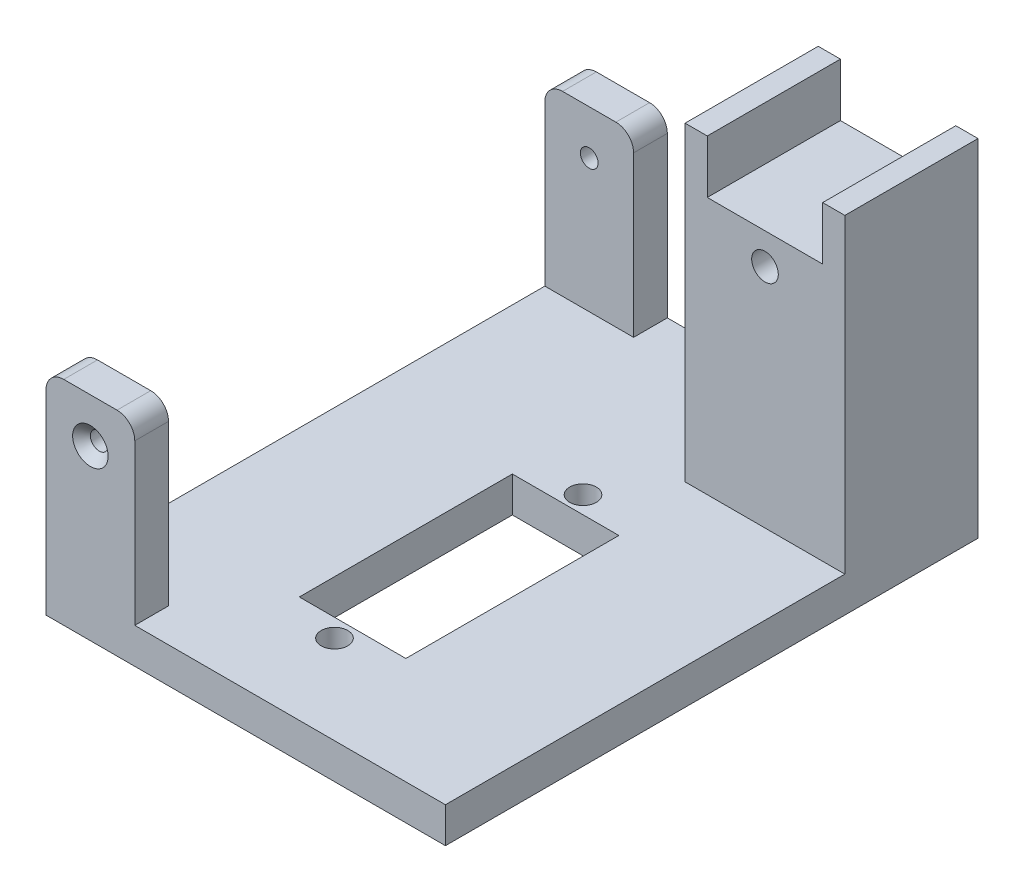
ISO-10303-21;
HEADER;
FILE_DESCRIPTION(('STEP AP214'),'2;1');
FILE_NAME('part.step','',(''),(''),'','','');
FILE_SCHEMA(('AUTOMOTIVE_DESIGN { 1 0 10303 214 1 1 1 1 }'));
ENDSEC;
DATA;
#1=APPLICATION_CONTEXT('core data for automotive mechanical design processes');
#2=APPLICATION_PROTOCOL_DEFINITION('international standard','automotive_design',2000,#1);
#3=PRODUCT_CONTEXT('',#1,'mechanical');
#4=PRODUCT('Part','Part','',(#3));
#5=PRODUCT_RELATED_PRODUCT_CATEGORY('part','',(#4));
#6=PRODUCT_DEFINITION_FORMATION('','',#4);
#7=PRODUCT_DEFINITION_CONTEXT('part definition',#1,'design');
#8=PRODUCT_DEFINITION('design','',#6,#7);
#9=PRODUCT_DEFINITION_SHAPE('','',#8);
#10=(LENGTH_UNIT() NAMED_UNIT(*) SI_UNIT(.MILLI.,.METRE.));
#11=(NAMED_UNIT(*) PLANE_ANGLE_UNIT() SI_UNIT($,.RADIAN.));
#12=(NAMED_UNIT(*) SI_UNIT($,.STERADIAN.) SOLID_ANGLE_UNIT());
#13=UNCERTAINTY_MEASURE_WITH_UNIT(LENGTH_MEASURE(1.E-05),#10,'distance_accuracy_value','');
#14=(GEOMETRIC_REPRESENTATION_CONTEXT(3) GLOBAL_UNCERTAINTY_ASSIGNED_CONTEXT((#13)) GLOBAL_UNIT_ASSIGNED_CONTEXT((#10,
#11,#12)) REPRESENTATION_CONTEXT('',''));
#15=CARTESIAN_POINT('',(0.,0.,0.));
#16=DIRECTION('',(0.,0.,1.));
#17=DIRECTION('',(1.,0.,0.));
#18=AXIS2_PLACEMENT_3D('',#15,#16,#17);
#19=CARTESIAN_POINT('',(0.,4.,0.));
#20=DIRECTION('',(0.,1.,0.));
#21=DIRECTION('',(0.,0.,1.));
#22=AXIS2_PLACEMENT_3D('',#19,#20,#21);
#23=PLANE('',#22);
#24=CARTESIAN_POINT('',(0.,4.,-8.));
#25=DIRECTION('',(0.,1.,0.));
#26=DIRECTION('',(0.,0.,1.));
#27=AXIS2_PLACEMENT_3D('',#24,#25,#26);
#28=CIRCLE('',#27,1.5);
#29=CARTESIAN_POINT('',(0.,4.,-6.5));
#30=VERTEX_POINT('',#29);
#31=EDGE_CURVE('E822',#30,#30,#28,.F.);
#32=ORIENTED_EDGE('',*,*,#31,.T.);
#33=EDGE_LOOP('',(#32));
#34=FACE_BOUND('',#33,.T.);
#35=CARTESIAN_POINT('',(0.,4.,20.));
#36=DIRECTION('',(0.,1.,0.));
#37=DIRECTION('',(0.,0.,1.));
#38=AXIS2_PLACEMENT_3D('',#35,#36,#37);
#39=CIRCLE('',#38,1.5);
#40=CARTESIAN_POINT('',(0.,4.,21.5));
#41=VERTEX_POINT('',#40);
#42=EDGE_CURVE('E826',#41,#41,#39,.F.);
#43=ORIENTED_EDGE('',*,*,#42,.T.);
#44=EDGE_LOOP('',(#43));
#45=FACE_BOUND('',#44,.T.);
#46=DIRECTION('',(1.,0.,0.));
#47=VECTOR('',#46,1.);
#48=CARTESIAN_POINT('',(4.50000000000001,4.,-15.));
#49=LINE('',#48,#47);
#50=CARTESIAN_POINT('',(4.50000000000001,4.,-15.));
#51=VERTEX_POINT('',#50);
#52=CARTESIAN_POINT('',(22.5,4.,-15.));
#53=VERTEX_POINT('',#52);
#54=EDGE_CURVE('E278',#51,#53,#49,.T.);
#55=ORIENTED_EDGE('',*,*,#54,.F.);
#56=DIRECTION('',(0.,0.,1.));
#57=VECTOR('',#56,1.);
#58=CARTESIAN_POINT('',(4.5,4.,-30.));
#59=LINE('',#58,#57);
#60=CARTESIAN_POINT('',(4.5,4.,-30.));
#61=VERTEX_POINT('',#60);
#62=EDGE_CURVE('E273',#61,#51,#59,.T.);
#63=ORIENTED_EDGE('',*,*,#62,.F.);
#64=DIRECTION('',(-1.,0.,0.));
#65=VECTOR('',#64,1.);
#66=CARTESIAN_POINT('',(-22.5,4.,-30.));
#67=LINE('',#66,#65);
#68=CARTESIAN_POINT('',(-12.5,4.,-30.));
#69=VERTEX_POINT('',#68);
#70=EDGE_CURVE('E344',#61,#69,#67,.T.);
#71=ORIENTED_EDGE('',*,*,#70,.T.);
#72=DIRECTION('',(0.,0.,-1.));
#73=VECTOR('',#72,1.);
#74=CARTESIAN_POINT('',(-12.5,4.,-30.));
#75=LINE('',#74,#73);
#76=CARTESIAN_POINT('',(-12.5,4.,-26.2));
#77=VERTEX_POINT('',#76);
#78=EDGE_CURVE('E313',#77,#69,#75,.T.);
#79=ORIENTED_EDGE('',*,*,#78,.F.);
#80=DIRECTION('',(1.,0.,0.));
#81=VECTOR('',#80,1.);
#82=CARTESIAN_POINT('',(-22.5,4.,-26.2));
#83=LINE('',#82,#81);
#84=CARTESIAN_POINT('',(-22.5,4.,-26.2));
#85=VERTEX_POINT('',#84);
#86=EDGE_CURVE('E309',#85,#77,#83,.T.);
#87=ORIENTED_EDGE('',*,*,#86,.F.);
#88=DIRECTION('',(0.,0.,1.));
#89=VECTOR('',#88,1.);
#90=CARTESIAN_POINT('',(-22.5,4.,-30.));
#91=LINE('',#90,#89);
#92=CARTESIAN_POINT('',(-22.5,4.,26.2));
#93=VERTEX_POINT('',#92);
#94=EDGE_CURVE('E348',#85,#93,#91,.T.);
#95=ORIENTED_EDGE('',*,*,#94,.T.);
#96=DIRECTION('',(-1.,0.,0.));
#97=VECTOR('',#96,1.);
#98=CARTESIAN_POINT('',(-22.5,4.,26.2));
#99=LINE('',#98,#97);
#100=CARTESIAN_POINT('',(-12.5,4.,26.2));
#101=VERTEX_POINT('',#100);
#102=EDGE_CURVE('E331',#101,#93,#99,.T.);
#103=ORIENTED_EDGE('',*,*,#102,.F.);
#104=DIRECTION('',(0.,0.,-1.));
#105=VECTOR('',#104,1.);
#106=CARTESIAN_POINT('',(-12.5,4.,26.2));
#107=LINE('',#106,#105);
#108=CARTESIAN_POINT('',(-12.5,4.,30.));
#109=VERTEX_POINT('',#108);
#110=EDGE_CURVE('E316',#109,#101,#107,.T.);
#111=ORIENTED_EDGE('',*,*,#110,.F.);
#112=DIRECTION('',(1.,0.,0.));
#113=VECTOR('',#112,1.);
#114=CARTESIAN_POINT('',(-22.5,4.,30.));
#115=LINE('',#114,#113);
#116=CARTESIAN_POINT('',(22.5,4.,30.));
#117=VERTEX_POINT('',#116);
#118=EDGE_CURVE('E351',#109,#117,#115,.T.);
#119=ORIENTED_EDGE('',*,*,#118,.T.);
#120=DIRECTION('',(0.,0.,-1.));
#121=VECTOR('',#120,1.);
#122=CARTESIAN_POINT('',(22.5,4.,-30.));
#123=LINE('',#122,#121);
#124=EDGE_CURVE('E341',#117,#53,#123,.T.);
#125=ORIENTED_EDGE('',*,*,#124,.T.);
#126=EDGE_LOOP('',(#55,#63,#71,#79,#87,#95,#103,#111,#119,#125));
#127=FACE_BOUND('',#126,.T.);
#128=DIRECTION('',(0.,0.,-1.));
#129=VECTOR('',#128,1.);
#130=CARTESIAN_POINT('',(6.,4.,17.9601856714293));
#131=LINE('',#130,#129);
#132=CARTESIAN_POINT('',(6.,4.,17.9601856714293));
#133=VERTEX_POINT('',#132);
#134=CARTESIAN_POINT('',(6.,4.,-6.03981432857072));
#135=VERTEX_POINT('',#134);
#136=EDGE_CURVE('E241',#133,#135,#131,.T.);
#137=ORIENTED_EDGE('',*,*,#136,.F.);
#138=DIRECTION('',(1.,0.,0.));
#139=VECTOR('',#138,1.);
#140=CARTESIAN_POINT('',(-6.,4.,17.9601856714293));
#141=LINE('',#140,#139);
#142=CARTESIAN_POINT('',(-6.,4.,17.9601856714293));
#143=VERTEX_POINT('',#142);
#144=EDGE_CURVE('E239',#143,#133,#141,.T.);
#145=ORIENTED_EDGE('',*,*,#144,.F.);
#146=DIRECTION('',(0.,0.,-1.));
#147=VECTOR('',#146,1.);
#148=CARTESIAN_POINT('',(-6.,4.,17.9601856714293));
#149=LINE('',#148,#147);
#150=CARTESIAN_POINT('',(-6.,4.,-6.03981432857072));
#151=VERTEX_POINT('',#150);
#152=EDGE_CURVE('E833',#143,#151,#149,.T.);
#153=ORIENTED_EDGE('',*,*,#152,.T.);
#154=DIRECTION('',(1.,0.,0.));
#155=VECTOR('',#154,1.);
#156=CARTESIAN_POINT('',(-6.,4.,-6.03981432857072));
#157=LINE('',#156,#155);
#158=EDGE_CURVE('E221',#151,#135,#157,.T.);
#159=ORIENTED_EDGE('',*,*,#158,.T.);
#160=EDGE_LOOP('',(#137,#145,#153,#159));
#161=FACE_BOUND('',#160,.T.);
#162=ADVANCED_FACE('F47',(#34,#45,#127,#161),#23,.T.);
#163=CARTESIAN_POINT('',(0.,0.,0.));
#164=DIRECTION('',(0.,1.,0.));
#165=DIRECTION('',(0.,0.,1.));
#166=AXIS2_PLACEMENT_3D('',#163,#164,#165);
#167=PLANE('',#166);
#168=CARTESIAN_POINT('',(0.,0.,-8.));
#169=DIRECTION('',(0.,-1.,0.));
#170=DIRECTION('',(0.,0.,-1.));
#171=AXIS2_PLACEMENT_3D('',#168,#169,#170);
#172=CIRCLE('',#171,1.5);
#173=CARTESIAN_POINT('',(0.,0.,-9.5));
#174=VERTEX_POINT('',#173);
#175=EDGE_CURVE('E249',#174,#174,#172,.T.);
#176=ORIENTED_EDGE('',*,*,#175,.F.);
#177=EDGE_LOOP('',(#176));
#178=FACE_BOUND('',#177,.T.);
#179=CARTESIAN_POINT('',(0.,0.,20.));
#180=DIRECTION('',(0.,-1.,0.));
#181=DIRECTION('',(0.,0.,-1.));
#182=AXIS2_PLACEMENT_3D('',#179,#180,#181);
#183=CIRCLE('',#182,1.5);
#184=CARTESIAN_POINT('',(0.,0.,18.5));
#185=VERTEX_POINT('',#184);
#186=EDGE_CURVE('E244',#185,#185,#183,.T.);
#187=ORIENTED_EDGE('',*,*,#186,.F.);
#188=EDGE_LOOP('',(#187));
#189=FACE_BOUND('',#188,.T.);
#190=DIRECTION('',(0.,0.,-1.));
#191=VECTOR('',#190,1.);
#192=CARTESIAN_POINT('',(22.5,0.,-30.));
#193=LINE('',#192,#191);
#194=CARTESIAN_POINT('',(22.5,0.,30.));
#195=VERTEX_POINT('',#194);
#196=CARTESIAN_POINT('',(22.5,0.,-30.));
#197=VERTEX_POINT('',#196);
#198=EDGE_CURVE('E324',#195,#197,#193,.T.);
#199=ORIENTED_EDGE('',*,*,#198,.F.);
#200=DIRECTION('',(1.,0.,0.));
#201=VECTOR('',#200,1.);
#202=CARTESIAN_POINT('',(-22.5,0.,30.));
#203=LINE('',#202,#201);
#204=CARTESIAN_POINT('',(-22.5,0.,30.));
#205=VERTEX_POINT('',#204);
#206=EDGE_CURVE('E345',#205,#195,#203,.T.);
#207=ORIENTED_EDGE('',*,*,#206,.F.);
#208=DIRECTION('',(0.,0.,1.));
#209=VECTOR('',#208,1.);
#210=CARTESIAN_POINT('',(-22.5,0.,-30.));
#211=LINE('',#210,#209);
#212=CARTESIAN_POINT('',(-22.5,0.,-30.));
#213=VERTEX_POINT('',#212);
#214=EDGE_CURVE('E359',#213,#205,#211,.T.);
#215=ORIENTED_EDGE('',*,*,#214,.F.);
#216=DIRECTION('',(-1.,0.,0.));
#217=VECTOR('',#216,1.);
#218=CARTESIAN_POINT('',(-22.5,0.,-30.));
#219=LINE('',#218,#217);
#220=EDGE_CURVE('E356',#197,#213,#219,.T.);
#221=ORIENTED_EDGE('',*,*,#220,.F.);
#222=EDGE_LOOP('',(#199,#207,#215,#221));
#223=FACE_BOUND('',#222,.T.);
#224=DIRECTION('',(1.,0.,0.));
#225=VECTOR('',#224,1.);
#226=CARTESIAN_POINT('',(-6.,0.,17.9601856714293));
#227=LINE('',#226,#225);
#228=CARTESIAN_POINT('',(-6.,0.,17.9601856714293));
#229=VERTEX_POINT('',#228);
#230=CARTESIAN_POINT('',(6.,0.,17.9601856714293));
#231=VERTEX_POINT('',#230);
#232=EDGE_CURVE('E71',#229,#231,#227,.T.);
#233=ORIENTED_EDGE('',*,*,#232,.T.);
#234=DIRECTION('',(0.,0.,-1.));
#235=VECTOR('',#234,1.);
#236=CARTESIAN_POINT('',(6.,0.,17.9601856714293));
#237=LINE('',#236,#235);
#238=CARTESIAN_POINT('',(6.,0.,-6.03981432857072));
#239=VERTEX_POINT('',#238);
#240=EDGE_CURVE('E233',#231,#239,#237,.T.);
#241=ORIENTED_EDGE('',*,*,#240,.T.);
#242=DIRECTION('',(1.,0.,0.));
#243=VECTOR('',#242,1.);
#244=CARTESIAN_POINT('',(-6.,0.,-6.03981432857072));
#245=LINE('',#244,#243);
#246=CARTESIAN_POINT('',(-6.,0.,-6.03981432857072));
#247=VERTEX_POINT('',#246);
#248=EDGE_CURVE('E218',#247,#239,#245,.T.);
#249=ORIENTED_EDGE('',*,*,#248,.F.);
#250=DIRECTION('',(0.,0.,-1.));
#251=VECTOR('',#250,1.);
#252=CARTESIAN_POINT('',(-6.,0.,17.9601856714293));
#253=LINE('',#252,#251);
#254=EDGE_CURVE('E227',#229,#247,#253,.T.);
#255=ORIENTED_EDGE('',*,*,#254,.F.);
#256=EDGE_LOOP('',(#233,#241,#249,#255));
#257=FACE_BOUND('',#256,.T.);
#258=ADVANCED_FACE('F231',(#178,#189,#223,#257),#167,.F.);
#259=CARTESIAN_POINT('',(0.,39.,0.));
#260=DIRECTION('',(0.,1.,0.));
#261=DIRECTION('',(0.,0.,1.));
#262=AXIS2_PLACEMENT_3D('',#259,#260,#261);
#263=PLANE('',#262);
#264=DIRECTION('',(0.,0.,-1.));
#265=VECTOR('',#264,1.);
#266=CARTESIAN_POINT('',(20.,39.,0.));
#267=LINE('',#266,#265);
#268=CARTESIAN_POINT('',(20.,39.,-15.));
#269=VERTEX_POINT('',#268);
#270=CARTESIAN_POINT('',(20.,39.,-30.));
#271=VERTEX_POINT('',#270);
#272=EDGE_CURVE('E372',#269,#271,#267,.T.);
#273=ORIENTED_EDGE('',*,*,#272,.F.);
#274=DIRECTION('',(1.,0.,0.));
#275=VECTOR('',#274,1.);
#276=CARTESIAN_POINT('',(4.50000000000001,39.,-15.));
#277=LINE('',#276,#275);
#278=CARTESIAN_POINT('',(22.5,39.,-15.));
#279=VERTEX_POINT('',#278);
#280=EDGE_CURVE('E284',#269,#279,#277,.T.);
#281=ORIENTED_EDGE('',*,*,#280,.T.);
#282=DIRECTION('',(0.,0.,-1.));
#283=VECTOR('',#282,1.);
#284=CARTESIAN_POINT('',(22.5,39.,-30.));
#285=LINE('',#284,#283);
#286=CARTESIAN_POINT('',(22.5,39.,-30.));
#287=VERTEX_POINT('',#286);
#288=EDGE_CURVE('E274',#279,#287,#285,.T.);
#289=ORIENTED_EDGE('',*,*,#288,.T.);
#290=DIRECTION('',(-1.,0.,0.));
#291=VECTOR('',#290,1.);
#292=CARTESIAN_POINT('',(4.5,39.,-30.));
#293=LINE('',#292,#291);
#294=EDGE_CURVE('E279',#287,#271,#293,.T.);
#295=ORIENTED_EDGE('',*,*,#294,.T.);
#296=EDGE_LOOP('',(#273,#281,#289,#295));
#297=FACE_BOUND('',#296,.T.);
#298=ADVANCED_FACE('F443',(#297),#263,.T.);
#299=CARTESIAN_POINT('',(22.5,4.,-30.));
#300=DIRECTION('',(-1.,0.,0.));
#301=DIRECTION('',(0.,0.,1.));
#302=AXIS2_PLACEMENT_3D('',#299,#300,#301);
#303=PLANE('',#302);
#304=ORIENTED_EDGE('',*,*,#198,.T.);
#305=DIRECTION('',(0.,-1.,0.));
#306=VECTOR('',#305,1.);
#307=CARTESIAN_POINT('',(22.5,4.,-30.));
#308=LINE('',#307,#306);
#309=EDGE_CURVE('E369',#287,#197,#308,.T.);
#310=ORIENTED_EDGE('',*,*,#309,.F.);
#311=ORIENTED_EDGE('',*,*,#288,.F.);
#312=DIRECTION('',(0.,-1.,0.));
#313=VECTOR('',#312,1.);
#314=CARTESIAN_POINT('',(22.5,39.,-15.));
#315=LINE('',#314,#313);
#316=EDGE_CURVE('E288',#279,#53,#315,.T.);
#317=ORIENTED_EDGE('',*,*,#316,.T.);
#318=ORIENTED_EDGE('',*,*,#124,.F.);
#319=DIRECTION('',(0.,-1.,0.));
#320=VECTOR('',#319,1.);
#321=CARTESIAN_POINT('',(22.5,4.,30.));
#322=LINE('',#321,#320);
#323=EDGE_CURVE('E353',#117,#195,#322,.T.);
#324=ORIENTED_EDGE('',*,*,#323,.T.);
#325=EDGE_LOOP('',(#304,#310,#311,#317,#318,#324));
#326=FACE_BOUND('',#325,.T.);
#327=ADVANCED_FACE('F464',(#326),#303,.F.);
#328=CARTESIAN_POINT('',(-22.5,4.,-30.));
#329=DIRECTION('',(0.,0.,1.));
#330=DIRECTION('',(1.,0.,0.));
#331=AXIS2_PLACEMENT_3D('',#328,#329,#330);
#332=PLANE('',#331);
#333=CARTESIAN_POINT('',(-17.5,19.,-30.));
#334=DIRECTION('',(0.,0.,1.));
#335=DIRECTION('',(1.,0.,0.));
#336=AXIS2_PLACEMENT_3D('',#333,#334,#335);
#337=CIRCLE('',#336,2.);
#338=CARTESIAN_POINT('',(-15.5,19.,-30.));
#339=VERTEX_POINT('',#338);
#340=EDGE_CURVE('E415',#339,#339,#337,.T.);
#341=ORIENTED_EDGE('',*,*,#340,.T.);
#342=EDGE_LOOP('',(#341));
#343=FACE_BOUND('',#342,.T.);
#344=CARTESIAN_POINT('',(13.5,29.5,-30.));
#345=DIRECTION('',(0.,0.,-1.));
#346=DIRECTION('',(-1.,0.,0.));
#347=AXIS2_PLACEMENT_3D('',#344,#345,#346);
#348=CIRCLE('',#347,1.5);
#349=CARTESIAN_POINT('',(12.,29.5,-30.));
#350=VERTEX_POINT('',#349);
#351=EDGE_CURVE('E245',#350,#350,#348,.T.);
#352=ORIENTED_EDGE('',*,*,#351,.F.);
#353=EDGE_LOOP('',(#352));
#354=FACE_BOUND('',#353,.T.);
#355=DIRECTION('',(-1.,0.,0.));
#356=VECTOR('',#355,1.);
#357=CARTESIAN_POINT('',(-22.5,24.,-30.));
#358=LINE('',#357,#356);
#359=CARTESIAN_POINT('',(-14.5,24.,-30.));
#360=VERTEX_POINT('',#359);
#361=CARTESIAN_POINT('',(-20.5,24.,-30.));
#362=VERTEX_POINT('',#361);
#363=EDGE_CURVE('E305',#360,#362,#358,.T.);
#364=ORIENTED_EDGE('',*,*,#363,.F.);
#365=CARTESIAN_POINT('',(-14.5,22.,-30.));
#366=DIRECTION('',(0.,0.,1.));
#367=DIRECTION('',(1.,0.,0.));
#368=AXIS2_PLACEMENT_3D('',#365,#366,#367);
#369=CIRCLE('',#368,2.);
#370=CARTESIAN_POINT('',(-12.5,22.,-30.));
#371=VERTEX_POINT('',#370);
#372=EDGE_CURVE('E384',#360,#371,#369,.F.);
#373=ORIENTED_EDGE('',*,*,#372,.T.);
#374=DIRECTION('',(0.,-1.,0.));
#375=VECTOR('',#374,1.);
#376=CARTESIAN_POINT('',(-12.5,24.,-30.));
#377=LINE('',#376,#375);
#378=EDGE_CURVE('E322',#371,#69,#377,.T.);
#379=ORIENTED_EDGE('',*,*,#378,.T.);
#380=ORIENTED_EDGE('',*,*,#70,.F.);
#381=DIRECTION('',(0.,-1.,0.));
#382=VECTOR('',#381,1.);
#383=CARTESIAN_POINT('',(4.5,39.,-30.));
#384=LINE('',#383,#382);
#385=CARTESIAN_POINT('',(4.5,39.,-30.));
#386=VERTEX_POINT('',#385);
#387=EDGE_CURVE('E296',#386,#61,#384,.T.);
#388=ORIENTED_EDGE('',*,*,#387,.F.);
#389=CARTESIAN_POINT('',(7.,39.,-30.));
#390=VERTEX_POINT('',#389);
#391=EDGE_CURVE('E277',#390,#386,#293,.T.);
#392=ORIENTED_EDGE('',*,*,#391,.F.);
#393=DIRECTION('',(0.,1.,0.));
#394=VECTOR('',#393,1.);
#395=CARTESIAN_POINT('',(7.,33.,-30.));
#396=LINE('',#395,#394);
#397=CARTESIAN_POINT('',(7.,33.,-30.));
#398=VERTEX_POINT('',#397);
#399=EDGE_CURVE('E263',#398,#390,#396,.T.);
#400=ORIENTED_EDGE('',*,*,#399,.F.);
#401=DIRECTION('',(-1.,0.,0.));
#402=VECTOR('',#401,1.);
#403=CARTESIAN_POINT('',(7.,33.,-30.));
#404=LINE('',#403,#402);
#405=CARTESIAN_POINT('',(20.,33.,-30.));
#406=VERTEX_POINT('',#405);
#407=EDGE_CURVE('E255',#406,#398,#404,.T.);
#408=ORIENTED_EDGE('',*,*,#407,.F.);
#409=DIRECTION('',(0.,1.,0.));
#410=VECTOR('',#409,1.);
#411=CARTESIAN_POINT('',(20.,33.,-30.));
#412=LINE('',#411,#410);
#413=EDGE_CURVE('E261',#406,#271,#412,.T.);
#414=ORIENTED_EDGE('',*,*,#413,.T.);
#415=ORIENTED_EDGE('',*,*,#294,.F.);
#416=ORIENTED_EDGE('',*,*,#309,.T.);
#417=ORIENTED_EDGE('',*,*,#220,.T.);
#418=DIRECTION('',(0.,-1.,0.));
#419=VECTOR('',#418,1.);
#420=CARTESIAN_POINT('',(-22.5,4.,-30.));
#421=LINE('',#420,#419);
#422=CARTESIAN_POINT('',(-22.5,22.,-30.));
#423=VERTEX_POINT('',#422);
#424=EDGE_CURVE('E367',#423,#213,#421,.T.);
#425=ORIENTED_EDGE('',*,*,#424,.F.);
#426=CARTESIAN_POINT('',(-20.5,22.,-30.));
#427=DIRECTION('',(0.,0.,1.));
#428=DIRECTION('',(1.,0.,0.));
#429=AXIS2_PLACEMENT_3D('',#426,#427,#428);
#430=CIRCLE('',#429,2.);
#431=EDGE_CURVE('E382',#423,#362,#430,.F.);
#432=ORIENTED_EDGE('',*,*,#431,.T.);
#433=EDGE_LOOP('',(#364,#373,#379,#380,#388,#392,#400,#408,#414,#415,#416,#417,#425,#432));
#434=FACE_BOUND('',#433,.T.);
#435=ADVANCED_FACE('F460',(#343,#354,#434),#332,.F.);
#436=CARTESIAN_POINT('',(-22.5,4.,-30.));
#437=DIRECTION('',(1.,0.,0.));
#438=DIRECTION('',(0.,0.,-1.));
#439=AXIS2_PLACEMENT_3D('',#436,#437,#438);
#440=PLANE('',#439);
#441=DIRECTION('',(0.,-1.,0.));
#442=VECTOR('',#441,1.);
#443=CARTESIAN_POINT('',(-22.5,24.,-26.2));
#444=LINE('',#443,#442);
#445=CARTESIAN_POINT('',(-22.5,22.,-26.2));
#446=VERTEX_POINT('',#445);
#447=EDGE_CURVE('E320',#446,#85,#444,.T.);
#448=ORIENTED_EDGE('',*,*,#447,.F.);
#449=DIRECTION('',(0.,0.,1.));
#450=VECTOR('',#449,1.);
#451=CARTESIAN_POINT('',(-22.5,22.,-30.));
#452=LINE('',#451,#450);
#453=EDGE_CURVE('E394',#446,#423,#452,.F.);
#454=ORIENTED_EDGE('',*,*,#453,.T.);
#455=ORIENTED_EDGE('',*,*,#424,.T.);
#456=ORIENTED_EDGE('',*,*,#214,.T.);
#457=DIRECTION('',(0.,-1.,0.));
#458=VECTOR('',#457,1.);
#459=CARTESIAN_POINT('',(-22.5,4.,30.));
#460=LINE('',#459,#458);
#461=CARTESIAN_POINT('',(-22.5,22.,30.));
#462=VERTEX_POINT('',#461);
#463=EDGE_CURVE('E365',#462,#205,#460,.T.);
#464=ORIENTED_EDGE('',*,*,#463,.F.);
#465=DIRECTION('',(0.,0.,1.));
#466=VECTOR('',#465,1.);
#467=CARTESIAN_POINT('',(-22.5,22.,26.2));
#468=LINE('',#467,#466);
#469=CARTESIAN_POINT('',(-22.5,22.,26.2));
#470=VERTEX_POINT('',#469);
#471=EDGE_CURVE('E392',#462,#470,#468,.F.);
#472=ORIENTED_EDGE('',*,*,#471,.T.);
#473=DIRECTION('',(0.,-1.,0.));
#474=VECTOR('',#473,1.);
#475=CARTESIAN_POINT('',(-22.5,24.,26.2));
#476=LINE('',#475,#474);
#477=EDGE_CURVE('E326',#470,#93,#476,.T.);
#478=ORIENTED_EDGE('',*,*,#477,.T.);
#479=ORIENTED_EDGE('',*,*,#94,.F.);
#480=EDGE_LOOP('',(#448,#454,#455,#456,#464,#472,#478,#479));
#481=FACE_BOUND('',#480,.T.);
#482=ADVANCED_FACE('F456',(#481),#440,.F.);
#483=CARTESIAN_POINT('',(-22.5,4.,30.));
#484=DIRECTION('',(0.,0.,-1.));
#485=DIRECTION('',(-1.,0.,0.));
#486=AXIS2_PLACEMENT_3D('',#483,#484,#485);
#487=PLANE('',#486);
#488=CARTESIAN_POINT('',(-17.5,19.,30.));
#489=DIRECTION('',(0.,0.,-1.));
#490=DIRECTION('',(-1.,0.,0.));
#491=AXIS2_PLACEMENT_3D('',#488,#489,#490);
#492=CIRCLE('',#491,2.00000000000001);
#493=CARTESIAN_POINT('',(-19.5,19.,30.));
#494=VERTEX_POINT('',#493);
#495=EDGE_CURVE('E13',#494,#494,#492,.T.);
#496=ORIENTED_EDGE('',*,*,#495,.T.);
#497=EDGE_LOOP('',(#496));
#498=FACE_BOUND('',#497,.T.);
#499=DIRECTION('',(0.,-1.,0.));
#500=VECTOR('',#499,1.);
#501=CARTESIAN_POINT('',(-12.5,24.,30.));
#502=LINE('',#501,#500);
#503=CARTESIAN_POINT('',(-12.5,22.,30.));
#504=VERTEX_POINT('',#503);
#505=EDGE_CURVE('E328',#504,#109,#502,.T.);
#506=ORIENTED_EDGE('',*,*,#505,.F.);
#507=CARTESIAN_POINT('',(-14.5,22.,30.));
#508=DIRECTION('',(0.,0.,-1.));
#509=DIRECTION('',(-1.,0.,0.));
#510=AXIS2_PLACEMENT_3D('',#507,#508,#509);
#511=CIRCLE('',#510,2.);
#512=CARTESIAN_POINT('',(-14.5,24.,30.));
#513=VERTEX_POINT('',#512);
#514=EDGE_CURVE('E410',#504,#513,#511,.F.);
#515=ORIENTED_EDGE('',*,*,#514,.T.);
#516=DIRECTION('',(1.,0.,0.));
#517=VECTOR('',#516,1.);
#518=CARTESIAN_POINT('',(-22.5,24.,30.));
#519=LINE('',#518,#517);
#520=CARTESIAN_POINT('',(-20.5,24.,30.));
#521=VERTEX_POINT('',#520);
#522=EDGE_CURVE('E330',#521,#513,#519,.T.);
#523=ORIENTED_EDGE('',*,*,#522,.F.);
#524=CARTESIAN_POINT('',(-20.5,22.,30.));
#525=DIRECTION('',(0.,0.,-1.));
#526=DIRECTION('',(-1.,0.,0.));
#527=AXIS2_PLACEMENT_3D('',#524,#525,#526);
#528=CIRCLE('',#527,2.);
#529=EDGE_CURVE('E408',#521,#462,#528,.F.);
#530=ORIENTED_EDGE('',*,*,#529,.T.);
#531=ORIENTED_EDGE('',*,*,#463,.T.);
#532=ORIENTED_EDGE('',*,*,#206,.T.);
#533=ORIENTED_EDGE('',*,*,#323,.F.);
#534=ORIENTED_EDGE('',*,*,#118,.F.);
#535=EDGE_LOOP('',(#506,#515,#523,#530,#531,#532,#533,#534));
#536=FACE_BOUND('',#535,.T.);
#537=ADVANCED_FACE('F452',(#498,#536),#487,.F.);
#538=CARTESIAN_POINT('',(-12.5,24.,26.2));
#539=DIRECTION('',(-1.,0.,0.));
#540=DIRECTION('',(0.,0.,1.));
#541=AXIS2_PLACEMENT_3D('',#538,#539,#540);
#542=PLANE('',#541);
#543=DIRECTION('',(0.,-1.,0.));
#544=VECTOR('',#543,1.);
#545=CARTESIAN_POINT('',(-12.5,24.,26.2));
#546=LINE('',#545,#544);
#547=CARTESIAN_POINT('',(-12.5,22.,26.2));
#548=VERTEX_POINT('',#547);
#549=EDGE_CURVE('E304',#548,#101,#546,.T.);
#550=ORIENTED_EDGE('',*,*,#549,.F.);
#551=DIRECTION('',(0.,0.,-1.));
#552=VECTOR('',#551,1.);
#553=CARTESIAN_POINT('',(-12.5,22.,30.));
#554=LINE('',#553,#552);
#555=EDGE_CURVE('E406',#548,#504,#554,.F.);
#556=ORIENTED_EDGE('',*,*,#555,.T.);
#557=ORIENTED_EDGE('',*,*,#505,.T.);
#558=ORIENTED_EDGE('',*,*,#110,.T.);
#559=EDGE_LOOP('',(#550,#556,#557,#558));
#560=FACE_BOUND('',#559,.T.);
#561=ADVANCED_FACE('F455',(#560),#542,.F.);
#562=CARTESIAN_POINT('',(-22.5,24.,26.2));
#563=DIRECTION('',(0.,0.,1.));
#564=DIRECTION('',(1.,0.,0.));
#565=AXIS2_PLACEMENT_3D('',#562,#563,#564);
#566=PLANE('',#565);
#567=CARTESIAN_POINT('',(-17.5,19.,26.2));
#568=DIRECTION('',(0.,0.,1.));
#569=DIRECTION('',(1.,0.,0.));
#570=AXIS2_PLACEMENT_3D('',#567,#568,#569);
#571=CIRCLE('',#570,1.00000000000001);
#572=CARTESIAN_POINT('',(-16.5,19.,26.2));
#573=VERTEX_POINT('',#572);
#574=EDGE_CURVE('E301',#573,#573,#571,.F.);
#575=ORIENTED_EDGE('',*,*,#574,.F.);
#576=EDGE_LOOP('',(#575));
#577=FACE_BOUND('',#576,.T.);
#578=DIRECTION('',(-1.,0.,0.));
#579=VECTOR('',#578,1.);
#580=CARTESIAN_POINT('',(-22.5,24.,26.2));
#581=LINE('',#580,#579);
#582=CARTESIAN_POINT('',(-14.5,24.,26.2));
#583=VERTEX_POINT('',#582);
#584=CARTESIAN_POINT('',(-20.5,24.,26.2));
#585=VERTEX_POINT('',#584);
#586=EDGE_CURVE('E334',#583,#585,#581,.T.);
#587=ORIENTED_EDGE('',*,*,#586,.F.);
#588=CARTESIAN_POINT('',(-14.5,22.,26.2));
#589=DIRECTION('',(0.,0.,1.));
#590=DIRECTION('',(1.,0.,0.));
#591=AXIS2_PLACEMENT_3D('',#588,#589,#590);
#592=CIRCLE('',#591,2.);
#593=EDGE_CURVE('E404',#583,#548,#592,.F.);
#594=ORIENTED_EDGE('',*,*,#593,.T.);
#595=ORIENTED_EDGE('',*,*,#549,.T.);
#596=ORIENTED_EDGE('',*,*,#102,.T.);
#597=ORIENTED_EDGE('',*,*,#477,.F.);
#598=CARTESIAN_POINT('',(-20.5,22.,26.2));
#599=DIRECTION('',(0.,0.,1.));
#600=DIRECTION('',(1.,0.,0.));
#601=AXIS2_PLACEMENT_3D('',#598,#599,#600);
#602=CIRCLE('',#601,2.);
#603=EDGE_CURVE('E402',#470,#585,#602,.F.);
#604=ORIENTED_EDGE('',*,*,#603,.T.);
#605=EDGE_LOOP('',(#587,#594,#595,#596,#597,#604));
#606=FACE_BOUND('',#605,.T.);
#607=ADVANCED_FACE('F497',(#577,#606),#566,.F.);
#608=CARTESIAN_POINT('',(0.,24.,0.));
#609=DIRECTION('',(0.,1.,0.));
#610=DIRECTION('',(0.,0.,1.));
#611=AXIS2_PLACEMENT_3D('',#608,#609,#610);
#612=PLANE('',#611);
#613=ORIENTED_EDGE('',*,*,#522,.T.);
#614=DIRECTION('',(0.,0.,-1.));
#615=VECTOR('',#614,1.);
#616=CARTESIAN_POINT('',(-14.5,24.,26.2));
#617=LINE('',#616,#615);
#618=EDGE_CURVE('E399',#513,#583,#617,.T.);
#619=ORIENTED_EDGE('',*,*,#618,.T.);
#620=ORIENTED_EDGE('',*,*,#586,.T.);
#621=DIRECTION('',(0.,0.,1.));
#622=VECTOR('',#621,1.);
#623=CARTESIAN_POINT('',(-20.5,24.,30.));
#624=LINE('',#623,#622);
#625=EDGE_CURVE('E396',#585,#521,#624,.T.);
#626=ORIENTED_EDGE('',*,*,#625,.T.);
#627=EDGE_LOOP('',(#613,#619,#620,#626));
#628=FACE_BOUND('',#627,.T.);
#629=ADVANCED_FACE('F449',(#628),#612,.T.);
#630=CARTESIAN_POINT('',(-12.5,24.,-30.));
#631=DIRECTION('',(-1.,0.,0.));
#632=DIRECTION('',(0.,0.,1.));
#633=AXIS2_PLACEMENT_3D('',#630,#631,#632);
#634=PLANE('',#633);
#635=ORIENTED_EDGE('',*,*,#378,.F.);
#636=DIRECTION('',(0.,0.,-1.));
#637=VECTOR('',#636,1.);
#638=CARTESIAN_POINT('',(-12.5,22.,-26.2));
#639=LINE('',#638,#637);
#640=CARTESIAN_POINT('',(-12.5,22.,-26.2));
#641=VERTEX_POINT('',#640);
#642=EDGE_CURVE('E386',#371,#641,#639,.F.);
#643=ORIENTED_EDGE('',*,*,#642,.T.);
#644=DIRECTION('',(0.,-1.,0.));
#645=VECTOR('',#644,1.);
#646=CARTESIAN_POINT('',(-12.5,24.,-26.2));
#647=LINE('',#646,#645);
#648=EDGE_CURVE('E312',#641,#77,#647,.T.);
#649=ORIENTED_EDGE('',*,*,#648,.T.);
#650=ORIENTED_EDGE('',*,*,#78,.T.);
#651=EDGE_LOOP('',(#635,#643,#649,#650));
#652=FACE_BOUND('',#651,.T.);
#653=ADVANCED_FACE('F538',(#652),#634,.F.);
#654=CARTESIAN_POINT('',(-22.5,24.,-26.2));
#655=DIRECTION('',(0.,0.,-1.));
#656=DIRECTION('',(-1.,0.,0.));
#657=AXIS2_PLACEMENT_3D('',#654,#655,#656);
#658=PLANE('',#657);
#659=CARTESIAN_POINT('',(-17.5,19.,-26.2));
#660=DIRECTION('',(0.,0.,-1.));
#661=DIRECTION('',(-1.,0.,0.));
#662=AXIS2_PLACEMENT_3D('',#659,#660,#661);
#663=CIRCLE('',#662,1.);
#664=CARTESIAN_POINT('',(-18.5,19.,-26.2));
#665=VERTEX_POINT('',#664);
#666=EDGE_CURVE('E298',#665,#665,#663,.F.);
#667=ORIENTED_EDGE('',*,*,#666,.F.);
#668=EDGE_LOOP('',(#667));
#669=FACE_BOUND('',#668,.T.);
#670=ORIENTED_EDGE('',*,*,#648,.F.);
#671=CARTESIAN_POINT('',(-14.5,22.,-26.2));
#672=DIRECTION('',(0.,0.,-1.));
#673=DIRECTION('',(-1.,0.,0.));
#674=AXIS2_PLACEMENT_3D('',#671,#672,#673);
#675=CIRCLE('',#674,2.);
#676=CARTESIAN_POINT('',(-14.5,24.,-26.2));
#677=VERTEX_POINT('',#676);
#678=EDGE_CURVE('E390',#641,#677,#675,.F.);
#679=ORIENTED_EDGE('',*,*,#678,.T.);
#680=DIRECTION('',(1.,0.,0.));
#681=VECTOR('',#680,1.);
#682=CARTESIAN_POINT('',(-22.5,24.,-26.2));
#683=LINE('',#682,#681);
#684=CARTESIAN_POINT('',(-20.5,24.,-26.2));
#685=VERTEX_POINT('',#684);
#686=EDGE_CURVE('E308',#685,#677,#683,.T.);
#687=ORIENTED_EDGE('',*,*,#686,.F.);
#688=CARTESIAN_POINT('',(-20.5,22.,-26.2));
#689=DIRECTION('',(0.,0.,-1.));
#690=DIRECTION('',(-1.,0.,0.));
#691=AXIS2_PLACEMENT_3D('',#688,#689,#690);
#692=CIRCLE('',#691,2.);
#693=EDGE_CURVE('E388',#685,#446,#692,.F.);
#694=ORIENTED_EDGE('',*,*,#693,.T.);
#695=ORIENTED_EDGE('',*,*,#447,.T.);
#696=ORIENTED_EDGE('',*,*,#86,.T.);
#697=EDGE_LOOP('',(#670,#679,#687,#694,#695,#696));
#698=FACE_BOUND('',#697,.T.);
#699=ADVANCED_FACE('F543',(#669,#698),#658,.F.);
#700=CARTESIAN_POINT('',(0.,24.,0.));
#701=DIRECTION('',(0.,1.,0.));
#702=DIRECTION('',(0.,0.,1.));
#703=AXIS2_PLACEMENT_3D('',#700,#701,#702);
#704=PLANE('',#703);
#705=ORIENTED_EDGE('',*,*,#686,.T.);
#706=DIRECTION('',(0.,0.,-1.));
#707=VECTOR('',#706,1.);
#708=CARTESIAN_POINT('',(-14.5,24.,-30.));
#709=LINE('',#708,#707);
#710=EDGE_CURVE('E379',#677,#360,#709,.T.);
#711=ORIENTED_EDGE('',*,*,#710,.T.);
#712=ORIENTED_EDGE('',*,*,#363,.T.);
#713=DIRECTION('',(0.,0.,1.));
#714=VECTOR('',#713,1.);
#715=CARTESIAN_POINT('',(-20.5,24.,-26.2));
#716=LINE('',#715,#714);
#717=EDGE_CURVE('E376',#362,#685,#716,.T.);
#718=ORIENTED_EDGE('',*,*,#717,.T.);
#719=EDGE_LOOP('',(#705,#711,#712,#718));
#720=FACE_BOUND('',#719,.T.);
#721=ADVANCED_FACE('F547',(#720),#704,.T.);
#722=CARTESIAN_POINT('',(-17.5,19.,-30.001));
#723=DIRECTION('',(0.,0.,1.));
#724=DIRECTION('',(1.,0.,0.));
#725=AXIS2_PLACEMENT_3D('',#722,#723,#724);
#726=CYLINDRICAL_SURFACE('',#725,1.00000000000001);
#727=CARTESIAN_POINT('',(-17.5,19.,29.));
#728=DIRECTION('',(0.,0.,-1.));
#729=DIRECTION('',(-1.,0.,0.));
#730=AXIS2_PLACEMENT_3D('',#727,#728,#729);
#731=CIRCLE('',#730,1.00000000000001);
#732=CARTESIAN_POINT('',(-18.5,19.,29.));
#733=VERTEX_POINT('',#732);
#734=EDGE_CURVE('E56',#733,#733,#731,.F.);
#735=ORIENTED_EDGE('',*,*,#734,.T.);
#736=EDGE_LOOP('',(#735));
#737=FACE_BOUND('',#736,.T.);
#738=ORIENTED_EDGE('',*,*,#574,.T.);
#739=EDGE_LOOP('',(#738));
#740=FACE_BOUND('',#739,.T.);
#741=ADVANCED_FACE('F420',(#737,#740),#726,.F.);
#742=CARTESIAN_POINT('',(-17.5,19.,30.001));
#743=DIRECTION('',(0.,0.,-1.));
#744=DIRECTION('',(-1.,0.,0.));
#745=AXIS2_PLACEMENT_3D('',#742,#743,#744);
#746=CYLINDRICAL_SURFACE('',#745,1.);
#747=CARTESIAN_POINT('',(-17.5,19.,-29.));
#748=DIRECTION('',(0.,0.,1.));
#749=DIRECTION('',(1.,0.,0.));
#750=AXIS2_PLACEMENT_3D('',#747,#748,#749);
#751=CIRCLE('',#750,1.);
#752=CARTESIAN_POINT('',(-16.5,19.,-29.));
#753=VERTEX_POINT('',#752);
#754=EDGE_CURVE('E412',#753,#753,#751,.F.);
#755=ORIENTED_EDGE('',*,*,#754,.T.);
#756=EDGE_LOOP('',(#755));
#757=FACE_BOUND('',#756,.T.);
#758=ORIENTED_EDGE('',*,*,#666,.T.);
#759=EDGE_LOOP('',(#758));
#760=FACE_BOUND('',#759,.T.);
#761=ADVANCED_FACE('F593',(#757,#760),#746,.F.);
#762=CARTESIAN_POINT('',(4.5,39.,-30.));
#763=DIRECTION('',(1.,0.,0.));
#764=DIRECTION('',(0.,0.,-1.));
#765=AXIS2_PLACEMENT_3D('',#762,#763,#764);
#766=PLANE('',#765);
#767=ORIENTED_EDGE('',*,*,#62,.T.);
#768=DIRECTION('',(0.,-1.,0.));
#769=VECTOR('',#768,1.);
#770=CARTESIAN_POINT('',(4.50000000000001,39.,-15.));
#771=LINE('',#770,#769);
#772=CARTESIAN_POINT('',(4.50000000000001,39.,-15.));
#773=VERTEX_POINT('',#772);
#774=EDGE_CURVE('E294',#773,#51,#771,.T.);
#775=ORIENTED_EDGE('',*,*,#774,.F.);
#776=DIRECTION('',(0.,0.,1.));
#777=VECTOR('',#776,1.);
#778=CARTESIAN_POINT('',(4.5,39.,-30.));
#779=LINE('',#778,#777);
#780=EDGE_CURVE('E282',#386,#773,#779,.T.);
#781=ORIENTED_EDGE('',*,*,#780,.F.);
#782=ORIENTED_EDGE('',*,*,#387,.T.);
#783=EDGE_LOOP('',(#767,#775,#781,#782));
#784=FACE_BOUND('',#783,.T.);
#785=ADVANCED_FACE('F528',(#784),#766,.F.);
#786=CARTESIAN_POINT('',(4.50000000000001,39.,-15.));
#787=DIRECTION('',(0.,0.,-1.));
#788=DIRECTION('',(-1.,0.,0.));
#789=AXIS2_PLACEMENT_3D('',#786,#787,#788);
#790=PLANE('',#789);
#791=CARTESIAN_POINT('',(13.5,29.5,-15.));
#792=DIRECTION('',(0.,0.,-1.));
#793=DIRECTION('',(-1.,0.,0.));
#794=AXIS2_PLACEMENT_3D('',#791,#792,#793);
#795=CIRCLE('',#794,1.5);
#796=CARTESIAN_POINT('',(12.,29.5,-15.));
#797=VERTEX_POINT('',#796);
#798=EDGE_CURVE('E248',#797,#797,#795,.F.);
#799=ORIENTED_EDGE('',*,*,#798,.F.);
#800=EDGE_LOOP('',(#799));
#801=FACE_BOUND('',#800,.T.);
#802=ORIENTED_EDGE('',*,*,#280,.F.);
#803=DIRECTION('',(0.,-1.,0.));
#804=VECTOR('',#803,1.);
#805=CARTESIAN_POINT('',(20.,39.,-15.));
#806=LINE('',#805,#804);
#807=CARTESIAN_POINT('',(20.,33.,-15.));
#808=VERTEX_POINT('',#807);
#809=EDGE_CURVE('E270',#269,#808,#806,.T.);
#810=ORIENTED_EDGE('',*,*,#809,.T.);
#811=DIRECTION('',(1.,0.,0.));
#812=VECTOR('',#811,1.);
#813=CARTESIAN_POINT('',(4.50000000000001,33.,-15.));
#814=LINE('',#813,#812);
#815=CARTESIAN_POINT('',(7.,33.,-15.));
#816=VERTEX_POINT('',#815);
#817=EDGE_CURVE('E374',#816,#808,#814,.T.);
#818=ORIENTED_EDGE('',*,*,#817,.F.);
#819=DIRECTION('',(0.,1.,0.));
#820=VECTOR('',#819,1.);
#821=CARTESIAN_POINT('',(7.,39.,-15.));
#822=LINE('',#821,#820);
#823=CARTESIAN_POINT('',(7.,39.,-15.));
#824=VERTEX_POINT('',#823);
#825=EDGE_CURVE('E265',#816,#824,#822,.T.);
#826=ORIENTED_EDGE('',*,*,#825,.T.);
#827=EDGE_CURVE('E285',#773,#824,#277,.T.);
#828=ORIENTED_EDGE('',*,*,#827,.F.);
#829=ORIENTED_EDGE('',*,*,#774,.T.);
#830=ORIENTED_EDGE('',*,*,#54,.T.);
#831=ORIENTED_EDGE('',*,*,#316,.F.);
#832=EDGE_LOOP('',(#802,#810,#818,#826,#828,#829,#830,#831));
#833=FACE_BOUND('',#832,.T.);
#834=ADVANCED_FACE('F523',(#801,#833),#790,.F.);
#835=DIRECTION('',(0.,0.,1.));
#836=VECTOR('',#835,1.);
#837=CARTESIAN_POINT('',(7.,39.,-30.));
#838=LINE('',#837,#836);
#839=EDGE_CURVE('E252',#390,#824,#838,.T.);
#840=ORIENTED_EDGE('',*,*,#839,.F.);
#841=ORIENTED_EDGE('',*,*,#391,.T.);
#842=ORIENTED_EDGE('',*,*,#780,.T.);
#843=ORIENTED_EDGE('',*,*,#827,.T.);
#844=EDGE_LOOP('',(#840,#841,#842,#843));
#845=FACE_BOUND('',#844,.T.);
#846=ADVANCED_FACE('F572',(#845),#263,.T.);
#847=CARTESIAN_POINT('',(0.,33.,0.));
#848=DIRECTION('',(0.,1.,0.));
#849=DIRECTION('',(0.,0.,1.));
#850=AXIS2_PLACEMENT_3D('',#847,#848,#849);
#851=PLANE('',#850);
#852=ORIENTED_EDGE('',*,*,#817,.T.);
#853=DIRECTION('',(0.,0.,-1.));
#854=VECTOR('',#853,1.);
#855=CARTESIAN_POINT('',(20.,33.,-30.));
#856=LINE('',#855,#854);
#857=EDGE_CURVE('E253',#808,#406,#856,.T.);
#858=ORIENTED_EDGE('',*,*,#857,.T.);
#859=ORIENTED_EDGE('',*,*,#407,.T.);
#860=DIRECTION('',(0.,0.,1.));
#861=VECTOR('',#860,1.);
#862=CARTESIAN_POINT('',(7.,33.,-30.));
#863=LINE('',#862,#861);
#864=EDGE_CURVE('E258',#398,#816,#863,.T.);
#865=ORIENTED_EDGE('',*,*,#864,.T.);
#866=EDGE_LOOP('',(#852,#858,#859,#865));
#867=FACE_BOUND('',#866,.T.);
#868=ADVANCED_FACE('F567',(#867),#851,.T.);
#869=CARTESIAN_POINT('',(20.,33.,-30.));
#870=DIRECTION('',(1.,0.,0.));
#871=DIRECTION('',(0.,0.,-1.));
#872=AXIS2_PLACEMENT_3D('',#869,#870,#871);
#873=PLANE('',#872);
#874=ORIENTED_EDGE('',*,*,#272,.T.);
#875=ORIENTED_EDGE('',*,*,#413,.F.);
#876=ORIENTED_EDGE('',*,*,#857,.F.);
#877=ORIENTED_EDGE('',*,*,#809,.F.);
#878=EDGE_LOOP('',(#874,#875,#876,#877));
#879=FACE_BOUND('',#878,.T.);
#880=ADVANCED_FACE('F565',(#879),#873,.F.);
#881=CARTESIAN_POINT('',(7.,33.,-30.));
#882=DIRECTION('',(-1.,0.,0.));
#883=DIRECTION('',(0.,0.,1.));
#884=AXIS2_PLACEMENT_3D('',#881,#882,#883);
#885=PLANE('',#884);
#886=ORIENTED_EDGE('',*,*,#864,.F.);
#887=ORIENTED_EDGE('',*,*,#399,.T.);
#888=ORIENTED_EDGE('',*,*,#839,.T.);
#889=ORIENTED_EDGE('',*,*,#825,.F.);
#890=EDGE_LOOP('',(#886,#887,#888,#889));
#891=FACE_BOUND('',#890,.T.);
#892=ADVANCED_FACE('F569',(#891),#885,.F.);
#893=CARTESIAN_POINT('',(13.5,29.5,30.001));
#894=DIRECTION('',(0.,0.,-1.));
#895=DIRECTION('',(-1.,0.,0.));
#896=AXIS2_PLACEMENT_3D('',#893,#894,#895);
#897=CYLINDRICAL_SURFACE('',#896,1.5);
#898=ORIENTED_EDGE('',*,*,#351,.T.);
#899=EDGE_LOOP('',(#898));
#900=FACE_BOUND('',#899,.T.);
#901=ORIENTED_EDGE('',*,*,#798,.T.);
#902=EDGE_LOOP('',(#901));
#903=FACE_BOUND('',#902,.T.);
#904=ADVANCED_FACE('F473',(#900,#903),#897,.F.);
#905=CARTESIAN_POINT('',(-14.5,22.,0.));
#906=DIRECTION('',(0.,0.,1.));
#907=DIRECTION('',(1.,0.,0.));
#908=AXIS2_PLACEMENT_3D('',#905,#906,#907);
#909=CYLINDRICAL_SURFACE('',#908,2.);
#910=ORIENTED_EDGE('',*,*,#678,.F.);
#911=ORIENTED_EDGE('',*,*,#642,.F.);
#912=ORIENTED_EDGE('',*,*,#372,.F.);
#913=ORIENTED_EDGE('',*,*,#710,.F.);
#914=EDGE_LOOP('',(#910,#911,#912,#913));
#915=FACE_BOUND('',#914,.T.);
#916=ADVANCED_FACE('F469',(#915),#909,.T.);
#917=CARTESIAN_POINT('',(-20.5,22.,0.));
#918=DIRECTION('',(0.,0.,-1.));
#919=DIRECTION('',(-1.,0.,0.));
#920=AXIS2_PLACEMENT_3D('',#917,#918,#919);
#921=CYLINDRICAL_SURFACE('',#920,2.);
#922=ORIENTED_EDGE('',*,*,#431,.F.);
#923=ORIENTED_EDGE('',*,*,#453,.F.);
#924=ORIENTED_EDGE('',*,*,#693,.F.);
#925=ORIENTED_EDGE('',*,*,#717,.F.);
#926=EDGE_LOOP('',(#922,#923,#924,#925));
#927=FACE_BOUND('',#926,.T.);
#928=ADVANCED_FACE('F472',(#927),#921,.T.);
#929=CARTESIAN_POINT('',(-14.5,22.,0.));
#930=DIRECTION('',(0.,0.,1.));
#931=DIRECTION('',(1.,0.,0.));
#932=AXIS2_PLACEMENT_3D('',#929,#930,#931);
#933=CYLINDRICAL_SURFACE('',#932,2.);
#934=ORIENTED_EDGE('',*,*,#514,.F.);
#935=ORIENTED_EDGE('',*,*,#555,.F.);
#936=ORIENTED_EDGE('',*,*,#593,.F.);
#937=ORIENTED_EDGE('',*,*,#618,.F.);
#938=EDGE_LOOP('',(#934,#935,#936,#937));
#939=FACE_BOUND('',#938,.T.);
#940=ADVANCED_FACE('F477',(#939),#933,.T.);
#941=CARTESIAN_POINT('',(-20.5,22.,0.));
#942=DIRECTION('',(0.,0.,-1.));
#943=DIRECTION('',(-1.,0.,0.));
#944=AXIS2_PLACEMENT_3D('',#941,#942,#943);
#945=CYLINDRICAL_SURFACE('',#944,2.);
#946=ORIENTED_EDGE('',*,*,#603,.F.);
#947=ORIENTED_EDGE('',*,*,#471,.F.);
#948=ORIENTED_EDGE('',*,*,#529,.F.);
#949=ORIENTED_EDGE('',*,*,#625,.F.);
#950=EDGE_LOOP('',(#946,#947,#948,#949));
#951=FACE_BOUND('',#950,.T.);
#952=ADVANCED_FACE('F435',(#951),#945,.T.);
#953=CARTESIAN_POINT('',(-17.5,19.,-29.));
#954=DIRECTION('',(0.,0.,-1.));
#955=DIRECTION('',(-1.,0.,0.));
#956=AXIS2_PLACEMENT_3D('',#953,#954,#955);
#957=CONICAL_SURFACE('',#956,1.,0.785398163397448);
#958=ORIENTED_EDGE('',*,*,#340,.F.);
#959=EDGE_LOOP('',(#958));
#960=FACE_BOUND('',#959,.T.);
#961=ORIENTED_EDGE('',*,*,#754,.F.);
#962=EDGE_LOOP('',(#961));
#963=FACE_BOUND('',#962,.T.);
#964=ADVANCED_FACE('F425',(#960,#963),#957,.F.);
#965=CARTESIAN_POINT('',(-17.5,19.,29.));
#966=DIRECTION('',(0.,0.,1.));
#967=DIRECTION('',(1.,0.,0.));
#968=AXIS2_PLACEMENT_3D('',#965,#966,#967);
#969=CONICAL_SURFACE('',#968,1.00000000000001,0.785398163397448);
#970=ORIENTED_EDGE('',*,*,#495,.F.);
#971=EDGE_LOOP('',(#970));
#972=FACE_BOUND('',#971,.T.);
#973=ORIENTED_EDGE('',*,*,#734,.F.);
#974=EDGE_LOOP('',(#973));
#975=FACE_BOUND('',#974,.T.);
#976=ADVANCED_FACE('F50',(#972,#975),#969,.F.);
#977=CARTESIAN_POINT('',(-6.,39.001,17.9601856714293));
#978=DIRECTION('',(0.,0.,-1.));
#979=DIRECTION('',(-1.,0.,0.));
#980=AXIS2_PLACEMENT_3D('',#977,#978,#979);
#981=PLANE('',#980);
#982=ORIENTED_EDGE('',*,*,#144,.T.);
#983=DIRECTION('',(0.,-1.,0.));
#984=VECTOR('',#983,1.);
#985=CARTESIAN_POINT('',(6.,39.001,17.9601856714293));
#986=LINE('',#985,#984);
#987=EDGE_CURVE('E835',#133,#231,#986,.T.);
#988=ORIENTED_EDGE('',*,*,#987,.T.);
#989=ORIENTED_EDGE('',*,*,#232,.F.);
#990=DIRECTION('',(0.,-1.,0.));
#991=VECTOR('',#990,1.);
#992=CARTESIAN_POINT('',(-6.,39.001,17.9601856714293));
#993=LINE('',#992,#991);
#994=EDGE_CURVE('E223',#143,#229,#993,.T.);
#995=ORIENTED_EDGE('',*,*,#994,.F.);
#996=EDGE_LOOP('',(#982,#988,#989,#995));
#997=FACE_BOUND('',#996,.T.);
#998=ADVANCED_FACE('F424',(#997),#981,.T.);
#999=CARTESIAN_POINT('',(6.,39.001,17.9601856714293));
#1000=DIRECTION('',(-1.,0.,0.));
#1001=DIRECTION('',(0.,0.,1.));
#1002=AXIS2_PLACEMENT_3D('',#999,#1000,#1001);
#1003=PLANE('',#1002);
#1004=ORIENTED_EDGE('',*,*,#136,.T.);
#1005=DIRECTION('',(0.,-1.,0.));
#1006=VECTOR('',#1005,1.);
#1007=CARTESIAN_POINT('',(6.,39.001,-6.03981432857072));
#1008=LINE('',#1007,#1006);
#1009=EDGE_CURVE('E224',#135,#239,#1008,.T.);
#1010=ORIENTED_EDGE('',*,*,#1009,.T.);
#1011=ORIENTED_EDGE('',*,*,#240,.F.);
#1012=ORIENTED_EDGE('',*,*,#987,.F.);
#1013=EDGE_LOOP('',(#1004,#1010,#1011,#1012));
#1014=FACE_BOUND('',#1013,.T.);
#1015=ADVANCED_FACE('F432',(#1014),#1003,.T.);
#1016=CARTESIAN_POINT('',(-6.,39.001,-6.03981432857072));
#1017=DIRECTION('',(0.,0.,-1.));
#1018=DIRECTION('',(-1.,0.,0.));
#1019=AXIS2_PLACEMENT_3D('',#1016,#1017,#1018);
#1020=PLANE('',#1019);
#1021=DIRECTION('',(0.,-1.,0.));
#1022=VECTOR('',#1021,1.);
#1023=CARTESIAN_POINT('',(-6.,39.001,-6.03981432857072));
#1024=LINE('',#1023,#1022);
#1025=EDGE_CURVE('E63',#151,#247,#1024,.T.);
#1026=ORIENTED_EDGE('',*,*,#1025,.T.);
#1027=ORIENTED_EDGE('',*,*,#248,.T.);
#1028=ORIENTED_EDGE('',*,*,#1009,.F.);
#1029=ORIENTED_EDGE('',*,*,#158,.F.);
#1030=EDGE_LOOP('',(#1026,#1027,#1028,#1029));
#1031=FACE_BOUND('',#1030,.T.);
#1032=ADVANCED_FACE('F215',(#1031),#1020,.F.);
#1033=CARTESIAN_POINT('',(-6.,39.001,17.9601856714293));
#1034=DIRECTION('',(-1.,0.,0.));
#1035=DIRECTION('',(0.,0.,1.));
#1036=AXIS2_PLACEMENT_3D('',#1033,#1034,#1035);
#1037=PLANE('',#1036);
#1038=ORIENTED_EDGE('',*,*,#994,.T.);
#1039=ORIENTED_EDGE('',*,*,#254,.T.);
#1040=ORIENTED_EDGE('',*,*,#1025,.F.);
#1041=ORIENTED_EDGE('',*,*,#152,.F.);
#1042=EDGE_LOOP('',(#1038,#1039,#1040,#1041));
#1043=FACE_BOUND('',#1042,.T.);
#1044=ADVANCED_FACE('F228',(#1043),#1037,.F.);
#1045=CARTESIAN_POINT('',(0.,39.001,20.));
#1046=DIRECTION('',(0.,-1.,0.));
#1047=DIRECTION('',(0.,0.,-1.));
#1048=AXIS2_PLACEMENT_3D('',#1045,#1046,#1047);
#1049=CYLINDRICAL_SURFACE('',#1048,1.5);
#1050=ORIENTED_EDGE('',*,*,#42,.F.);
#1051=EDGE_LOOP('',(#1050));
#1052=FACE_BOUND('',#1051,.T.);
#1053=ORIENTED_EDGE('',*,*,#186,.T.);
#1054=EDGE_LOOP('',(#1053));
#1055=FACE_BOUND('',#1054,.T.);
#1056=ADVANCED_FACE('F794',(#1052,#1055),#1049,.F.);
#1057=CARTESIAN_POINT('',(0.,39.001,-8.));
#1058=DIRECTION('',(0.,-1.,0.));
#1059=DIRECTION('',(0.,0.,-1.));
#1060=AXIS2_PLACEMENT_3D('',#1057,#1058,#1059);
#1061=CYLINDRICAL_SURFACE('',#1060,1.5);
#1062=ORIENTED_EDGE('',*,*,#31,.F.);
#1063=EDGE_LOOP('',(#1062));
#1064=FACE_BOUND('',#1063,.T.);
#1065=ORIENTED_EDGE('',*,*,#175,.T.);
#1066=EDGE_LOOP('',(#1065));
#1067=FACE_BOUND('',#1066,.T.);
#1068=ADVANCED_FACE('F802',(#1064,#1067),#1061,.F.);
#1069=CLOSED_SHELL('',(#162,#258,#298,#327,#435,#482,#537,#561,#607,#629,#653,#699,#721,#741,
#761,#785,#834,#846,#868,#880,#892,#904,#916,#928,#940,#952,#964,#976,#998,#1015,#1032,#1044,
#1056,#1068));
#1070=MANIFOLD_SOLID_BREP('B2',#1069);
#1071=ADVANCED_BREP_SHAPE_REPRESENTATION('',(#18,#1070),#14);
#1072=SHAPE_DEFINITION_REPRESENTATION(#9,#1071);
ENDSEC;
END-ISO-10303-21;
